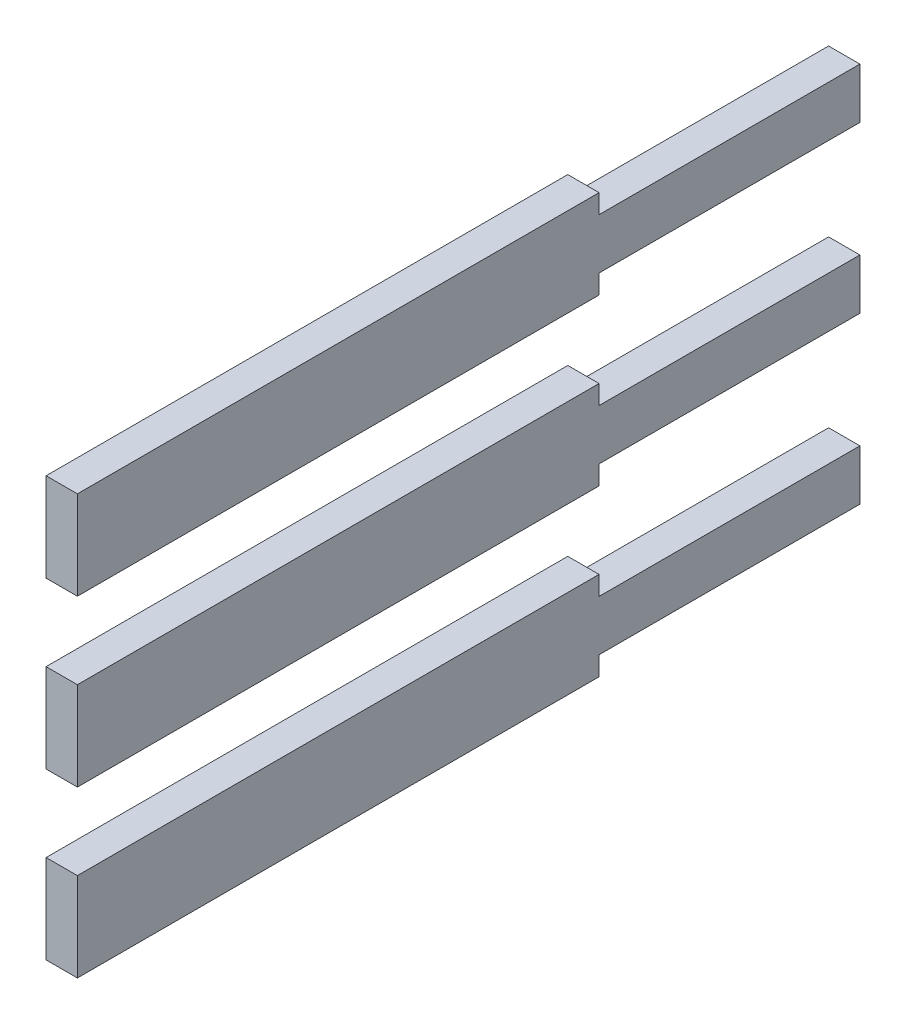
ISO-10303-21;
HEADER;
FILE_DESCRIPTION(('STEP AP214'),'2;1');
FILE_NAME('part.step','',(''),(''),'','','');
FILE_SCHEMA(('AUTOMOTIVE_DESIGN { 1 0 10303 214 1 1 1 1 }'));
ENDSEC;
DATA;
#1=APPLICATION_CONTEXT('core data for automotive mechanical design processes');
#2=APPLICATION_PROTOCOL_DEFINITION('international standard','automotive_design',2000,#1);
#3=PRODUCT_CONTEXT('',#1,'mechanical');
#4=PRODUCT('Part','Part','',(#3));
#5=PRODUCT_RELATED_PRODUCT_CATEGORY('part','',(#4));
#6=PRODUCT_DEFINITION_FORMATION('','',#4);
#7=PRODUCT_DEFINITION_CONTEXT('part definition',#1,'design');
#8=PRODUCT_DEFINITION('design','',#6,#7);
#9=PRODUCT_DEFINITION_SHAPE('','',#8);
#10=(LENGTH_UNIT() NAMED_UNIT(*) SI_UNIT(.MILLI.,.METRE.));
#11=(NAMED_UNIT(*) PLANE_ANGLE_UNIT() SI_UNIT($,.RADIAN.));
#12=(NAMED_UNIT(*) SI_UNIT($,.STERADIAN.) SOLID_ANGLE_UNIT());
#13=UNCERTAINTY_MEASURE_WITH_UNIT(LENGTH_MEASURE(1.E-05),#10,'distance_accuracy_value','');
#14=(GEOMETRIC_REPRESENTATION_CONTEXT(3) GLOBAL_UNCERTAINTY_ASSIGNED_CONTEXT((#13)) GLOBAL_UNIT_ASSIGNED_CONTEXT((#10,
#11,#12)) REPRESENTATION_CONTEXT('',''));
#15=CARTESIAN_POINT('',(0.,0.,0.));
#16=DIRECTION('',(0.,0.,1.));
#17=DIRECTION('',(1.,0.,0.));
#18=AXIS2_PLACEMENT_3D('',#15,#16,#17);
#19=CARTESIAN_POINT('',(-0.3,0.,0.));
#20=DIRECTION('',(1.,0.,0.));
#21=DIRECTION('',(0.,1.,0.));
#22=AXIS2_PLACEMENT_3D('',#19,#20,#21);
#23=PLANE('',#22);
#24=DIRECTION('',(0.,1.,0.));
#25=VECTOR('',#24,1.);
#26=CARTESIAN_POINT('',(-0.3,-0.68,0.));
#27=LINE('',#26,#25);
#28=CARTESIAN_POINT('',(-0.3,0.3875,0.));
#29=VERTEX_POINT('',#28);
#30=CARTESIAN_POINT('',(-0.3,0.68,0.));
#31=VERTEX_POINT('',#30);
#32=EDGE_CURVE('P0_E20',#29,#31,#27,.T.);
#33=ORIENTED_EDGE('',*,*,#32,.T.);
#34=DIRECTION('',(0.,0.,1.));
#35=VECTOR('',#34,1.);
#36=CARTESIAN_POINT('',(-0.3,0.68,0.));
#37=LINE('',#36,#35);
#38=CARTESIAN_POINT('',(-0.3,0.68,8.));
#39=VERTEX_POINT('',#38);
#40=EDGE_CURVE('P0_E105',#31,#39,#37,.T.);
#41=ORIENTED_EDGE('',*,*,#40,.T.);
#42=DIRECTION('',(0.,-1.,0.));
#43=VECTOR('',#42,1.);
#44=CARTESIAN_POINT('',(-0.3,0.68,8.));
#45=LINE('',#44,#43);
#46=CARTESIAN_POINT('',(-0.3,-0.68,8.));
#47=VERTEX_POINT('',#46);
#48=EDGE_CURVE('P0_E178',#39,#47,#45,.T.);
#49=ORIENTED_EDGE('',*,*,#48,.T.);
#50=DIRECTION('',(0.,0.,-1.));
#51=VECTOR('',#50,1.);
#52=CARTESIAN_POINT('',(-0.3,-0.68,8.));
#53=LINE('',#52,#51);
#54=CARTESIAN_POINT('',(-0.3,-0.68,0.));
#55=VERTEX_POINT('',#54);
#56=EDGE_CURVE('P0_E159',#47,#55,#53,.T.);
#57=ORIENTED_EDGE('',*,*,#56,.T.);
#58=DIRECTION('',(0.,1.,0.));
#59=VECTOR('',#58,1.);
#60=CARTESIAN_POINT('',(-0.3,-0.68,0.));
#61=LINE('',#60,#59);
#62=CARTESIAN_POINT('',(-0.3,-0.3875,0.));
#63=VERTEX_POINT('',#62);
#64=EDGE_CURVE('P0_E165',#55,#63,#61,.T.);
#65=ORIENTED_EDGE('',*,*,#64,.T.);
#66=DIRECTION('',(0.,0.,1.));
#67=VECTOR('',#66,1.);
#68=CARTESIAN_POINT('',(-0.3,-0.3875,-4.));
#69=LINE('',#68,#67);
#70=CARTESIAN_POINT('',(-0.3,-0.3875,-4.));
#71=VERTEX_POINT('',#70);
#72=EDGE_CURVE('P0_E27',#71,#63,#69,.T.);
#73=ORIENTED_EDGE('',*,*,#72,.F.);
#74=DIRECTION('',(0.,-1.,0.));
#75=VECTOR('',#74,1.);
#76=CARTESIAN_POINT('',(-0.3,0.3875,-4.));
#77=LINE('',#76,#75);
#78=CARTESIAN_POINT('',(-0.3,0.3875,-4.));
#79=VERTEX_POINT('',#78);
#80=EDGE_CURVE('P0_E11',#79,#71,#77,.T.);
#81=ORIENTED_EDGE('',*,*,#80,.F.);
#82=DIRECTION('',(0.,0.,-1.));
#83=VECTOR('',#82,1.);
#84=CARTESIAN_POINT('',(-0.3,0.3875,4.));
#85=LINE('',#84,#83);
#86=EDGE_CURVE('P0_E173',#29,#79,#85,.T.);
#87=ORIENTED_EDGE('',*,*,#86,.F.);
#88=EDGE_LOOP('',(#33,#41,#49,#57,#65,#73,#81,#87));
#89=FACE_BOUND('',#88,.T.);
#90=ADVANCED_FACE('P0_F16',(#89),#23,.T.);
#91=CARTESIAN_POINT('',(-0.3,0.3875,-4.));
#92=DIRECTION('',(0.,0.,-1.));
#93=DIRECTION('',(0.,-1.,0.));
#94=AXIS2_PLACEMENT_3D('',#91,#92,#93);
#95=PLANE('',#94);
#96=ORIENTED_EDGE('',*,*,#80,.T.);
#97=DIRECTION('',(-1.,0.,0.));
#98=VECTOR('',#97,1.);
#99=CARTESIAN_POINT('',(-0.3,-0.3875,-4.));
#100=LINE('',#99,#98);
#101=CARTESIAN_POINT('',(-0.78,-0.3875,-4.));
#102=VERTEX_POINT('',#101);
#103=EDGE_CURVE('P0_E184',#71,#102,#100,.T.);
#104=ORIENTED_EDGE('',*,*,#103,.T.);
#105=DIRECTION('',(0.,-1.,0.));
#106=VECTOR('',#105,1.);
#107=CARTESIAN_POINT('',(-0.78,0.3875,-4.));
#108=LINE('',#107,#106);
#109=CARTESIAN_POINT('',(-0.78,0.3875,-4.));
#110=VERTEX_POINT('',#109);
#111=EDGE_CURVE('P0_E138',#110,#102,#108,.T.);
#112=ORIENTED_EDGE('',*,*,#111,.F.);
#113=DIRECTION('',(-1.,0.,0.));
#114=VECTOR('',#113,1.);
#115=CARTESIAN_POINT('',(-0.3,0.3875,-4.));
#116=LINE('',#115,#114);
#117=EDGE_CURVE('P0_E177',#79,#110,#116,.T.);
#118=ORIENTED_EDGE('',*,*,#117,.F.);
#119=EDGE_LOOP('',(#96,#104,#112,#118));
#120=FACE_BOUND('',#119,.T.);
#121=ADVANCED_FACE('P0_F282',(#120),#95,.T.);
#122=CARTESIAN_POINT('',(-0.3,-0.3875,-4.));
#123=DIRECTION('',(0.,-1.,0.));
#124=DIRECTION('',(0.,0.,-1.));
#125=AXIS2_PLACEMENT_3D('',#122,#123,#124);
#126=PLANE('',#125);
#127=DIRECTION('',(-1.,0.,0.));
#128=VECTOR('',#127,1.);
#129=CARTESIAN_POINT('',(-0.3,-0.3875,0.));
#130=LINE('',#129,#128);
#131=CARTESIAN_POINT('',(-0.78,-0.3875,0.));
#132=VERTEX_POINT('',#131);
#133=EDGE_CURVE('P0_E136',#63,#132,#130,.T.);
#134=ORIENTED_EDGE('',*,*,#133,.T.);
#135=DIRECTION('',(0.,0.,1.));
#136=VECTOR('',#135,1.);
#137=CARTESIAN_POINT('',(-0.78,-0.3875,-4.));
#138=LINE('',#137,#136);
#139=EDGE_CURVE('P0_E141',#102,#132,#138,.T.);
#140=ORIENTED_EDGE('',*,*,#139,.F.);
#141=ORIENTED_EDGE('',*,*,#103,.F.);
#142=ORIENTED_EDGE('',*,*,#72,.T.);
#143=EDGE_LOOP('',(#134,#140,#141,#142));
#144=FACE_BOUND('',#143,.T.);
#145=ADVANCED_FACE('P0_F194',(#144),#126,.T.);
#146=CARTESIAN_POINT('',(-0.3,0.3875,4.));
#147=DIRECTION('',(0.,1.,0.));
#148=DIRECTION('',(1.,0.,0.));
#149=AXIS2_PLACEMENT_3D('',#146,#147,#148);
#150=PLANE('',#149);
#151=DIRECTION('',(1.,0.,0.));
#152=VECTOR('',#151,1.);
#153=CARTESIAN_POINT('',(-0.3,0.3875,0.));
#154=LINE('',#153,#152);
#155=CARTESIAN_POINT('',(-0.78,0.3875,0.));
#156=VERTEX_POINT('',#155);
#157=EDGE_CURVE('P0_E110',#156,#29,#154,.T.);
#158=ORIENTED_EDGE('',*,*,#157,.T.);
#159=ORIENTED_EDGE('',*,*,#86,.T.);
#160=ORIENTED_EDGE('',*,*,#117,.T.);
#161=DIRECTION('',(0.,0.,-1.));
#162=VECTOR('',#161,1.);
#163=CARTESIAN_POINT('',(-0.78,0.3875,4.));
#164=LINE('',#163,#162);
#165=EDGE_CURVE('P0_E120',#156,#110,#164,.T.);
#166=ORIENTED_EDGE('',*,*,#165,.F.);
#167=EDGE_LOOP('',(#158,#159,#160,#166));
#168=FACE_BOUND('',#167,.T.);
#169=ADVANCED_FACE('P0_F18',(#168),#150,.T.);
#170=CARTESIAN_POINT('',(-0.3,-0.68,8.));
#171=DIRECTION('',(0.,0.,1.));
#172=DIRECTION('',(1.,0.,0.));
#173=AXIS2_PLACEMENT_3D('',#170,#171,#172);
#174=PLANE('',#173);
#175=ORIENTED_EDGE('',*,*,#48,.F.);
#176=DIRECTION('',(-1.,0.,0.));
#177=VECTOR('',#176,1.);
#178=CARTESIAN_POINT('',(-0.3,0.68,8.));
#179=LINE('',#178,#177);
#180=CARTESIAN_POINT('',(-0.78,0.68,8.));
#181=VERTEX_POINT('',#180);
#182=EDGE_CURVE('P0_E162',#39,#181,#179,.T.);
#183=ORIENTED_EDGE('',*,*,#182,.T.);
#184=DIRECTION('',(0.,1.,0.));
#185=VECTOR('',#184,1.);
#186=CARTESIAN_POINT('',(-0.78,0.68,8.));
#187=LINE('',#186,#185);
#188=CARTESIAN_POINT('',(-0.78,-0.68,8.));
#189=VERTEX_POINT('',#188);
#190=EDGE_CURVE('P0_E126',#189,#181,#187,.T.);
#191=ORIENTED_EDGE('',*,*,#190,.F.);
#192=DIRECTION('',(-1.,0.,0.));
#193=VECTOR('',#192,1.);
#194=CARTESIAN_POINT('',(-0.3,-0.68,8.));
#195=LINE('',#194,#193);
#196=EDGE_CURVE('P0_E155',#47,#189,#195,.T.);
#197=ORIENTED_EDGE('',*,*,#196,.F.);
#198=EDGE_LOOP('',(#175,#183,#191,#197));
#199=FACE_BOUND('',#198,.T.);
#200=ADVANCED_FACE('P0_F280',(#199),#174,.T.);
#201=CARTESIAN_POINT('',(-0.3,0.68,8.));
#202=DIRECTION('',(0.,1.,0.));
#203=DIRECTION('',(1.,0.,0.));
#204=AXIS2_PLACEMENT_3D('',#201,#202,#203);
#205=PLANE('',#204);
#206=ORIENTED_EDGE('',*,*,#40,.F.);
#207=DIRECTION('',(-1.,0.,0.));
#208=VECTOR('',#207,1.);
#209=CARTESIAN_POINT('',(-0.3,0.68,0.));
#210=LINE('',#209,#208);
#211=CARTESIAN_POINT('',(-0.78,0.68,0.));
#212=VERTEX_POINT('',#211);
#213=EDGE_CURVE('P0_E97',#31,#212,#210,.T.);
#214=ORIENTED_EDGE('',*,*,#213,.T.);
#215=DIRECTION('',(0.,0.,-1.));
#216=VECTOR('',#215,1.);
#217=CARTESIAN_POINT('',(-0.78,0.68,0.));
#218=LINE('',#217,#216);
#219=EDGE_CURVE('P0_E102',#181,#212,#218,.T.);
#220=ORIENTED_EDGE('',*,*,#219,.F.);
#221=ORIENTED_EDGE('',*,*,#182,.F.);
#222=EDGE_LOOP('',(#206,#214,#220,#221));
#223=FACE_BOUND('',#222,.T.);
#224=ADVANCED_FACE('P0_F99',(#223),#205,.T.);
#225=CARTESIAN_POINT('',(-0.3,0.68,0.));
#226=DIRECTION('',(0.,0.,-1.));
#227=DIRECTION('',(0.,-1.,0.));
#228=AXIS2_PLACEMENT_3D('',#225,#226,#227);
#229=PLANE('',#228);
#230=ORIENTED_EDGE('',*,*,#157,.F.);
#231=DIRECTION('',(0.,-1.,0.));
#232=VECTOR('',#231,1.);
#233=CARTESIAN_POINT('',(-0.78,-0.68,0.));
#234=LINE('',#233,#232);
#235=EDGE_CURVE('P0_E113',#212,#156,#234,.T.);
#236=ORIENTED_EDGE('',*,*,#235,.F.);
#237=ORIENTED_EDGE('',*,*,#213,.F.);
#238=ORIENTED_EDGE('',*,*,#32,.F.);
#239=EDGE_LOOP('',(#230,#236,#237,#238));
#240=FACE_BOUND('',#239,.T.);
#241=ADVANCED_FACE('P0_F114',(#240),#229,.T.);
#242=CARTESIAN_POINT('',(-0.3,-0.68,0.));
#243=DIRECTION('',(0.,-1.,0.));
#244=DIRECTION('',(0.,0.,-1.));
#245=AXIS2_PLACEMENT_3D('',#242,#243,#244);
#246=PLANE('',#245);
#247=ORIENTED_EDGE('',*,*,#56,.F.);
#248=ORIENTED_EDGE('',*,*,#196,.T.);
#249=DIRECTION('',(0.,0.,1.));
#250=VECTOR('',#249,1.);
#251=CARTESIAN_POINT('',(-0.78,-0.68,8.));
#252=LINE('',#251,#250);
#253=CARTESIAN_POINT('',(-0.78,-0.68,0.));
#254=VERTEX_POINT('',#253);
#255=EDGE_CURVE('P0_E133',#254,#189,#252,.T.);
#256=ORIENTED_EDGE('',*,*,#255,.F.);
#257=DIRECTION('',(-1.,0.,0.));
#258=VECTOR('',#257,1.);
#259=CARTESIAN_POINT('',(-0.3,-0.68,0.));
#260=LINE('',#259,#258);
#261=EDGE_CURVE('P0_E169',#55,#254,#260,.T.);
#262=ORIENTED_EDGE('',*,*,#261,.F.);
#263=EDGE_LOOP('',(#247,#248,#256,#262));
#264=FACE_BOUND('',#263,.T.);
#265=ADVANCED_FACE('P0_F277',(#264),#246,.T.);
#266=CARTESIAN_POINT('',(-0.3,0.68,0.));
#267=DIRECTION('',(0.,0.,-1.));
#268=DIRECTION('',(0.,-1.,0.));
#269=AXIS2_PLACEMENT_3D('',#266,#267,#268);
#270=PLANE('',#269);
#271=ORIENTED_EDGE('',*,*,#133,.F.);
#272=ORIENTED_EDGE('',*,*,#64,.F.);
#273=ORIENTED_EDGE('',*,*,#261,.T.);
#274=DIRECTION('',(0.,-1.,0.));
#275=VECTOR('',#274,1.);
#276=CARTESIAN_POINT('',(-0.78,-0.68,0.));
#277=LINE('',#276,#275);
#278=EDGE_CURVE('P0_E170',#132,#254,#277,.T.);
#279=ORIENTED_EDGE('',*,*,#278,.F.);
#280=EDGE_LOOP('',(#271,#272,#273,#279));
#281=FACE_BOUND('',#280,.T.);
#282=ADVANCED_FACE('P0_F202',(#281),#270,.T.);
#283=CARTESIAN_POINT('',(-0.78,0.,4.));
#284=DIRECTION('',(-1.,0.,0.));
#285=DIRECTION('',(0.,0.,1.));
#286=AXIS2_PLACEMENT_3D('',#283,#284,#285);
#287=PLANE('',#286);
#288=ORIENTED_EDGE('',*,*,#278,.T.);
#289=ORIENTED_EDGE('',*,*,#255,.T.);
#290=ORIENTED_EDGE('',*,*,#190,.T.);
#291=ORIENTED_EDGE('',*,*,#219,.T.);
#292=ORIENTED_EDGE('',*,*,#235,.T.);
#293=ORIENTED_EDGE('',*,*,#165,.T.);
#294=ORIENTED_EDGE('',*,*,#111,.T.);
#295=ORIENTED_EDGE('',*,*,#139,.T.);
#296=EDGE_LOOP('',(#288,#289,#290,#291,#292,#293,#294,#295));
#297=FACE_BOUND('',#296,.T.);
#298=ADVANCED_FACE('P0_F123',(#297),#287,.T.);
#299=CLOSED_SHELL('',(#90,#121,#145,#169,#200,#224,#241,#265,#282,#298));
#300=MANIFOLD_SOLID_BREP('P0_B1',#299);
#301=CARTESIAN_POINT('',(-0.3,2.535,0.));
#302=DIRECTION('',(1.,0.,0.));
#303=DIRECTION('',(0.,1.,0.));
#304=AXIS2_PLACEMENT_3D('',#301,#302,#303);
#305=PLANE('',#304);
#306=DIRECTION('',(0.,1.,0.));
#307=VECTOR('',#306,1.);
#308=CARTESIAN_POINT('',(-0.3,1.855,0.));
#309=LINE('',#308,#307);
#310=CARTESIAN_POINT('',(-0.3,2.9225,0.));
#311=VERTEX_POINT('',#310);
#312=CARTESIAN_POINT('',(-0.3,3.215,0.));
#313=VERTEX_POINT('',#312);
#314=EDGE_CURVE('P1_E156',#311,#313,#309,.T.);
#315=ORIENTED_EDGE('',*,*,#314,.T.);
#316=DIRECTION('',(0.,0.,1.));
#317=VECTOR('',#316,1.);
#318=CARTESIAN_POINT('',(-0.3,3.215,0.));
#319=LINE('',#318,#317);
#320=CARTESIAN_POINT('',(-0.3,3.215,8.));
#321=VERTEX_POINT('',#320);
#322=EDGE_CURVE('P1_E152',#313,#321,#319,.T.);
#323=ORIENTED_EDGE('',*,*,#322,.T.);
#324=DIRECTION('',(0.,-1.,0.));
#325=VECTOR('',#324,1.);
#326=CARTESIAN_POINT('',(-0.3,3.215,8.));
#327=LINE('',#326,#325);
#328=CARTESIAN_POINT('',(-0.3,1.855,8.));
#329=VERTEX_POINT('',#328);
#330=EDGE_CURVE('P1_E160',#321,#329,#327,.T.);
#331=ORIENTED_EDGE('',*,*,#330,.T.);
#332=DIRECTION('',(0.,0.,-1.));
#333=VECTOR('',#332,1.);
#334=CARTESIAN_POINT('',(-0.3,1.855,8.));
#335=LINE('',#334,#333);
#336=CARTESIAN_POINT('',(-0.3,1.855,0.));
#337=VERTEX_POINT('',#336);
#338=EDGE_CURVE('P1_E168',#329,#337,#335,.T.);
#339=ORIENTED_EDGE('',*,*,#338,.T.);
#340=DIRECTION('',(0.,1.,0.));
#341=VECTOR('',#340,1.);
#342=CARTESIAN_POINT('',(-0.3,1.855,0.));
#343=LINE('',#342,#341);
#344=CARTESIAN_POINT('',(-0.3,2.1475,0.));
#345=VERTEX_POINT('',#344);
#346=EDGE_CURVE('P1_E121',#337,#345,#343,.T.);
#347=ORIENTED_EDGE('',*,*,#346,.T.);
#348=DIRECTION('',(0.,0.,1.));
#349=VECTOR('',#348,1.);
#350=CARTESIAN_POINT('',(-0.3,2.1475,-4.));
#351=LINE('',#350,#349);
#352=CARTESIAN_POINT('',(-0.3,2.1475,-4.));
#353=VERTEX_POINT('',#352);
#354=EDGE_CURVE('P1_E27',#353,#345,#351,.T.);
#355=ORIENTED_EDGE('',*,*,#354,.F.);
#356=DIRECTION('',(0.,-1.,0.));
#357=VECTOR('',#356,1.);
#358=CARTESIAN_POINT('',(-0.3,2.9225,-4.));
#359=LINE('',#358,#357);
#360=CARTESIAN_POINT('',(-0.3,2.9225,-4.));
#361=VERTEX_POINT('',#360);
#362=EDGE_CURVE('P1_E11',#361,#353,#359,.T.);
#363=ORIENTED_EDGE('',*,*,#362,.F.);
#364=DIRECTION('',(0.,0.,-1.));
#365=VECTOR('',#364,1.);
#366=CARTESIAN_POINT('',(-0.3,2.9225,4.));
#367=LINE('',#366,#365);
#368=EDGE_CURVE('P1_E162',#311,#361,#367,.T.);
#369=ORIENTED_EDGE('',*,*,#368,.F.);
#370=EDGE_LOOP('',(#315,#323,#331,#339,#347,#355,#363,#369));
#371=FACE_BOUND('',#370,.T.);
#372=ADVANCED_FACE('P1_F16',(#371),#305,.T.);
#373=CARTESIAN_POINT('',(-0.3,2.9225,-4.));
#374=DIRECTION('',(0.,0.,-1.));
#375=DIRECTION('',(0.,-1.,0.));
#376=AXIS2_PLACEMENT_3D('',#373,#374,#375);
#377=PLANE('',#376);
#378=ORIENTED_EDGE('',*,*,#362,.T.);
#379=DIRECTION('',(-1.,0.,0.));
#380=VECTOR('',#379,1.);
#381=CARTESIAN_POINT('',(-0.3,2.1475,-4.));
#382=LINE('',#381,#380);
#383=CARTESIAN_POINT('',(-0.78,2.1475,-4.));
#384=VERTEX_POINT('',#383);
#385=EDGE_CURVE('P1_E194',#353,#384,#382,.T.);
#386=ORIENTED_EDGE('',*,*,#385,.T.);
#387=DIRECTION('',(0.,-1.,0.));
#388=VECTOR('',#387,1.);
#389=CARTESIAN_POINT('',(-0.78,2.9225,-4.));
#390=LINE('',#389,#388);
#391=CARTESIAN_POINT('',(-0.78,2.9225,-4.));
#392=VERTEX_POINT('',#391);
#393=EDGE_CURVE('P1_E130',#392,#384,#390,.T.);
#394=ORIENTED_EDGE('',*,*,#393,.F.);
#395=DIRECTION('',(-1.,0.,0.));
#396=VECTOR('',#395,1.);
#397=CARTESIAN_POINT('',(-0.3,2.9225,-4.));
#398=LINE('',#397,#396);
#399=EDGE_CURVE('P1_E148',#361,#392,#398,.T.);
#400=ORIENTED_EDGE('',*,*,#399,.F.);
#401=EDGE_LOOP('',(#378,#386,#394,#400));
#402=FACE_BOUND('',#401,.T.);
#403=ADVANCED_FACE('P1_F274',(#402),#377,.T.);
#404=CARTESIAN_POINT('',(-0.3,2.1475,-4.));
#405=DIRECTION('',(0.,-1.,0.));
#406=DIRECTION('',(0.,0.,-1.));
#407=AXIS2_PLACEMENT_3D('',#404,#405,#406);
#408=PLANE('',#407);
#409=DIRECTION('',(-1.,0.,0.));
#410=VECTOR('',#409,1.);
#411=CARTESIAN_POINT('',(-0.3,2.1475,0.));
#412=LINE('',#411,#410);
#413=CARTESIAN_POINT('',(-0.78,2.1475,0.));
#414=VERTEX_POINT('',#413);
#415=EDGE_CURVE('P1_E110',#345,#414,#412,.T.);
#416=ORIENTED_EDGE('',*,*,#415,.T.);
#417=DIRECTION('',(0.,0.,1.));
#418=VECTOR('',#417,1.);
#419=CARTESIAN_POINT('',(-0.78,2.1475,-4.));
#420=LINE('',#419,#418);
#421=EDGE_CURVE('P1_E114',#384,#414,#420,.T.);
#422=ORIENTED_EDGE('',*,*,#421,.F.);
#423=ORIENTED_EDGE('',*,*,#385,.F.);
#424=ORIENTED_EDGE('',*,*,#354,.T.);
#425=EDGE_LOOP('',(#416,#422,#423,#424));
#426=FACE_BOUND('',#425,.T.);
#427=ADVANCED_FACE('P1_F112',(#426),#408,.T.);
#428=CARTESIAN_POINT('',(-0.3,2.9225,4.));
#429=DIRECTION('',(0.,1.,0.));
#430=DIRECTION('',(1.,0.,0.));
#431=AXIS2_PLACEMENT_3D('',#428,#429,#430);
#432=PLANE('',#431);
#433=DIRECTION('',(1.,0.,0.));
#434=VECTOR('',#433,1.);
#435=CARTESIAN_POINT('',(-0.3,2.9225,0.));
#436=LINE('',#435,#434);
#437=CARTESIAN_POINT('',(-0.78,2.9225,0.));
#438=VERTEX_POINT('',#437);
#439=EDGE_CURVE('P1_E83',#438,#311,#436,.T.);
#440=ORIENTED_EDGE('',*,*,#439,.T.);
#441=ORIENTED_EDGE('',*,*,#368,.T.);
#442=ORIENTED_EDGE('',*,*,#399,.T.);
#443=DIRECTION('',(0.,0.,-1.));
#444=VECTOR('',#443,1.);
#445=CARTESIAN_POINT('',(-0.78,2.9225,4.));
#446=LINE('',#445,#444);
#447=EDGE_CURVE('P1_E159',#438,#392,#446,.T.);
#448=ORIENTED_EDGE('',*,*,#447,.F.);
#449=EDGE_LOOP('',(#440,#441,#442,#448));
#450=FACE_BOUND('',#449,.T.);
#451=ADVANCED_FACE('P1_F273',(#450),#432,.T.);
#452=CARTESIAN_POINT('',(-0.3,1.855,8.));
#453=DIRECTION('',(0.,0.,1.));
#454=DIRECTION('',(1.,0.,0.));
#455=AXIS2_PLACEMENT_3D('',#452,#453,#454);
#456=PLANE('',#455);
#457=ORIENTED_EDGE('',*,*,#330,.F.);
#458=DIRECTION('',(-1.,0.,0.));
#459=VECTOR('',#458,1.);
#460=CARTESIAN_POINT('',(-0.3,3.215,8.));
#461=LINE('',#460,#459);
#462=CARTESIAN_POINT('',(-0.78,3.215,8.));
#463=VERTEX_POINT('',#462);
#464=EDGE_CURVE('P1_E20',#321,#463,#461,.T.);
#465=ORIENTED_EDGE('',*,*,#464,.T.);
#466=DIRECTION('',(0.,1.,0.));
#467=VECTOR('',#466,1.);
#468=CARTESIAN_POINT('',(-0.78,3.215,8.));
#469=LINE('',#468,#467);
#470=CARTESIAN_POINT('',(-0.78,1.855,8.));
#471=VERTEX_POINT('',#470);
#472=EDGE_CURVE('P1_E144',#471,#463,#469,.T.);
#473=ORIENTED_EDGE('',*,*,#472,.F.);
#474=DIRECTION('',(-1.,0.,0.));
#475=VECTOR('',#474,1.);
#476=CARTESIAN_POINT('',(-0.3,1.855,8.));
#477=LINE('',#476,#475);
#478=EDGE_CURVE('P1_E166',#329,#471,#477,.T.);
#479=ORIENTED_EDGE('',*,*,#478,.F.);
#480=EDGE_LOOP('',(#457,#465,#473,#479));
#481=FACE_BOUND('',#480,.T.);
#482=ADVANCED_FACE('P1_F18',(#481),#456,.T.);
#483=CARTESIAN_POINT('',(-0.3,3.215,8.));
#484=DIRECTION('',(0.,1.,0.));
#485=DIRECTION('',(1.,0.,0.));
#486=AXIS2_PLACEMENT_3D('',#483,#484,#485);
#487=PLANE('',#486);
#488=ORIENTED_EDGE('',*,*,#322,.F.);
#489=DIRECTION('',(-1.,0.,0.));
#490=VECTOR('',#489,1.);
#491=CARTESIAN_POINT('',(-0.3,3.215,0.));
#492=LINE('',#491,#490);
#493=CARTESIAN_POINT('',(-0.78,3.215,0.));
#494=VERTEX_POINT('',#493);
#495=EDGE_CURVE('P1_E96',#313,#494,#492,.T.);
#496=ORIENTED_EDGE('',*,*,#495,.T.);
#497=DIRECTION('',(0.,0.,-1.));
#498=VECTOR('',#497,1.);
#499=CARTESIAN_POINT('',(-0.78,3.215,0.));
#500=LINE('',#499,#498);
#501=EDGE_CURVE('P1_E185',#463,#494,#500,.T.);
#502=ORIENTED_EDGE('',*,*,#501,.F.);
#503=ORIENTED_EDGE('',*,*,#464,.F.);
#504=EDGE_LOOP('',(#488,#496,#502,#503));
#505=FACE_BOUND('',#504,.T.);
#506=ADVANCED_FACE('P1_F293',(#505),#487,.T.);
#507=CARTESIAN_POINT('',(-0.3,3.215,0.));
#508=DIRECTION('',(0.,0.,-1.));
#509=DIRECTION('',(0.,-1.,0.));
#510=AXIS2_PLACEMENT_3D('',#507,#508,#509);
#511=PLANE('',#510);
#512=ORIENTED_EDGE('',*,*,#439,.F.);
#513=DIRECTION('',(0.,-1.,0.));
#514=VECTOR('',#513,1.);
#515=CARTESIAN_POINT('',(-0.78,1.855,0.));
#516=LINE('',#515,#514);
#517=EDGE_CURVE('P1_E165',#494,#438,#516,.T.);
#518=ORIENTED_EDGE('',*,*,#517,.F.);
#519=ORIENTED_EDGE('',*,*,#495,.F.);
#520=ORIENTED_EDGE('',*,*,#314,.F.);
#521=EDGE_LOOP('',(#512,#518,#519,#520));
#522=FACE_BOUND('',#521,.T.);
#523=ADVANCED_FACE('P1_F287',(#522),#511,.T.);
#524=CARTESIAN_POINT('',(-0.3,1.855,0.));
#525=DIRECTION('',(0.,-1.,0.));
#526=DIRECTION('',(0.,0.,-1.));
#527=AXIS2_PLACEMENT_3D('',#524,#525,#526);
#528=PLANE('',#527);
#529=ORIENTED_EDGE('',*,*,#338,.F.);
#530=ORIENTED_EDGE('',*,*,#478,.T.);
#531=DIRECTION('',(0.,0.,1.));
#532=VECTOR('',#531,1.);
#533=CARTESIAN_POINT('',(-0.78,1.855,8.));
#534=LINE('',#533,#532);
#535=CARTESIAN_POINT('',(-0.78,1.855,0.));
#536=VERTEX_POINT('',#535);
#537=EDGE_CURVE('P1_E138',#536,#471,#534,.T.);
#538=ORIENTED_EDGE('',*,*,#537,.F.);
#539=DIRECTION('',(-1.,0.,0.));
#540=VECTOR('',#539,1.);
#541=CARTESIAN_POINT('',(-0.3,1.855,0.));
#542=LINE('',#541,#540);
#543=EDGE_CURVE('P1_E135',#337,#536,#542,.T.);
#544=ORIENTED_EDGE('',*,*,#543,.F.);
#545=EDGE_LOOP('',(#529,#530,#538,#544));
#546=FACE_BOUND('',#545,.T.);
#547=ADVANCED_FACE('P1_F292',(#546),#528,.T.);
#548=CARTESIAN_POINT('',(-0.3,3.215,0.));
#549=DIRECTION('',(0.,0.,-1.));
#550=DIRECTION('',(0.,-1.,0.));
#551=AXIS2_PLACEMENT_3D('',#548,#549,#550);
#552=PLANE('',#551);
#553=ORIENTED_EDGE('',*,*,#415,.F.);
#554=ORIENTED_EDGE('',*,*,#346,.F.);
#555=ORIENTED_EDGE('',*,*,#543,.T.);
#556=DIRECTION('',(0.,-1.,0.));
#557=VECTOR('',#556,1.);
#558=CARTESIAN_POINT('',(-0.78,1.855,0.));
#559=LINE('',#558,#557);
#560=EDGE_CURVE('P1_E127',#414,#536,#559,.T.);
#561=ORIENTED_EDGE('',*,*,#560,.F.);
#562=EDGE_LOOP('',(#553,#554,#555,#561));
#563=FACE_BOUND('',#562,.T.);
#564=ADVANCED_FACE('P1_F133',(#563),#552,.T.);
#565=CARTESIAN_POINT('',(-0.78,2.535,4.));
#566=DIRECTION('',(-1.,0.,0.));
#567=DIRECTION('',(0.,0.,1.));
#568=AXIS2_PLACEMENT_3D('',#565,#566,#567);
#569=PLANE('',#568);
#570=ORIENTED_EDGE('',*,*,#560,.T.);
#571=ORIENTED_EDGE('',*,*,#537,.T.);
#572=ORIENTED_EDGE('',*,*,#472,.T.);
#573=ORIENTED_EDGE('',*,*,#501,.T.);
#574=ORIENTED_EDGE('',*,*,#517,.T.);
#575=ORIENTED_EDGE('',*,*,#447,.T.);
#576=ORIENTED_EDGE('',*,*,#393,.T.);
#577=ORIENTED_EDGE('',*,*,#421,.T.);
#578=EDGE_LOOP('',(#570,#571,#572,#573,#574,#575,#576,#577));
#579=FACE_BOUND('',#578,.T.);
#580=ADVANCED_FACE('P1_F125',(#579),#569,.T.);
#581=CLOSED_SHELL('',(#372,#403,#427,#451,#482,#506,#523,#547,#564,#580));
#582=MANIFOLD_SOLID_BREP('P1_B1',#581);
#583=CARTESIAN_POINT('',(-0.3,-2.535,0.));
#584=DIRECTION('',(1.,0.,0.));
#585=DIRECTION('',(0.,1.,0.));
#586=AXIS2_PLACEMENT_3D('',#583,#584,#585);
#587=PLANE('',#586);
#588=DIRECTION('',(0.,1.,0.));
#589=VECTOR('',#588,1.);
#590=CARTESIAN_POINT('',(-0.3,-3.215,0.));
#591=LINE('',#590,#589);
#592=CARTESIAN_POINT('',(-0.3,-2.1475,0.));
#593=VERTEX_POINT('',#592);
#594=CARTESIAN_POINT('',(-0.3,-1.855,0.));
#595=VERTEX_POINT('',#594);
#596=EDGE_CURVE('P2_E94',#593,#595,#591,.T.);
#597=ORIENTED_EDGE('',*,*,#596,.T.);
#598=DIRECTION('',(0.,0.,1.));
#599=VECTOR('',#598,1.);
#600=CARTESIAN_POINT('',(-0.3,-1.855,0.));
#601=LINE('',#600,#599);
#602=CARTESIAN_POINT('',(-0.3,-1.855,8.));
#603=VERTEX_POINT('',#602);
#604=EDGE_CURVE('P2_E84',#595,#603,#601,.T.);
#605=ORIENTED_EDGE('',*,*,#604,.T.);
#606=DIRECTION('',(0.,-1.,0.));
#607=VECTOR('',#606,1.);
#608=CARTESIAN_POINT('',(-0.3,-1.855,8.));
#609=LINE('',#608,#607);
#610=CARTESIAN_POINT('',(-0.3,-3.215,8.));
#611=VERTEX_POINT('',#610);
#612=EDGE_CURVE('P2_E76',#603,#611,#609,.T.);
#613=ORIENTED_EDGE('',*,*,#612,.T.);
#614=DIRECTION('',(0.,0.,-1.));
#615=VECTOR('',#614,1.);
#616=CARTESIAN_POINT('',(-0.3,-3.215,8.));
#617=LINE('',#616,#615);
#618=CARTESIAN_POINT('',(-0.3,-3.215,0.));
#619=VERTEX_POINT('',#618);
#620=EDGE_CURVE('P2_E140',#611,#619,#617,.T.);
#621=ORIENTED_EDGE('',*,*,#620,.T.);
#622=DIRECTION('',(0.,1.,0.));
#623=VECTOR('',#622,1.);
#624=CARTESIAN_POINT('',(-0.3,-3.215,0.));
#625=LINE('',#624,#623);
#626=CARTESIAN_POINT('',(-0.3,-2.9225,0.));
#627=VERTEX_POINT('',#626);
#628=EDGE_CURVE('P2_E148',#619,#627,#625,.T.);
#629=ORIENTED_EDGE('',*,*,#628,.T.);
#630=DIRECTION('',(0.,0.,1.));
#631=VECTOR('',#630,1.);
#632=CARTESIAN_POINT('',(-0.3,-2.9225,-4.));
#633=LINE('',#632,#631);
#634=CARTESIAN_POINT('',(-0.3,-2.9225,-4.));
#635=VERTEX_POINT('',#634);
#636=EDGE_CURVE('P2_E20',#635,#627,#633,.T.);
#637=ORIENTED_EDGE('',*,*,#636,.F.);
#638=DIRECTION('',(0.,-1.,0.));
#639=VECTOR('',#638,1.);
#640=CARTESIAN_POINT('',(-0.3,-2.1475,-4.));
#641=LINE('',#640,#639);
#642=CARTESIAN_POINT('',(-0.3,-2.1475,-4.));
#643=VERTEX_POINT('',#642);
#644=EDGE_CURVE('P2_E11',#643,#635,#641,.T.);
#645=ORIENTED_EDGE('',*,*,#644,.F.);
#646=DIRECTION('',(0.,0.,-1.));
#647=VECTOR('',#646,1.);
#648=CARTESIAN_POINT('',(-0.3,-2.1475,4.));
#649=LINE('',#648,#647);
#650=EDGE_CURVE('P2_E98',#593,#643,#649,.T.);
#651=ORIENTED_EDGE('',*,*,#650,.F.);
#652=EDGE_LOOP('',(#597,#605,#613,#621,#629,#637,#645,#651));
#653=FACE_BOUND('',#652,.T.);
#654=ADVANCED_FACE('P2_F16',(#653),#587,.T.);
#655=CARTESIAN_POINT('',(-0.3,-2.1475,-4.));
#656=DIRECTION('',(0.,0.,-1.));
#657=DIRECTION('',(0.,-1.,0.));
#658=AXIS2_PLACEMENT_3D('',#655,#656,#657);
#659=PLANE('',#658);
#660=ORIENTED_EDGE('',*,*,#644,.T.);
#661=DIRECTION('',(-1.,0.,0.));
#662=VECTOR('',#661,1.);
#663=CARTESIAN_POINT('',(-0.3,-2.9225,-4.));
#664=LINE('',#663,#662);
#665=CARTESIAN_POINT('',(-0.78,-2.9225,-4.));
#666=VERTEX_POINT('',#665);
#667=EDGE_CURVE('P2_E160',#635,#666,#664,.T.);
#668=ORIENTED_EDGE('',*,*,#667,.T.);
#669=DIRECTION('',(0.,-1.,0.));
#670=VECTOR('',#669,1.);
#671=CARTESIAN_POINT('',(-0.78,-2.1475,-4.));
#672=LINE('',#671,#670);
#673=CARTESIAN_POINT('',(-0.78,-2.1475,-4.));
#674=VERTEX_POINT('',#673);
#675=EDGE_CURVE('P2_E119',#674,#666,#672,.T.);
#676=ORIENTED_EDGE('',*,*,#675,.F.);
#677=DIRECTION('',(-1.,0.,0.));
#678=VECTOR('',#677,1.);
#679=CARTESIAN_POINT('',(-0.3,-2.1475,-4.));
#680=LINE('',#679,#678);
#681=EDGE_CURVE('P2_E157',#643,#674,#680,.T.);
#682=ORIENTED_EDGE('',*,*,#681,.F.);
#683=EDGE_LOOP('',(#660,#668,#676,#682));
#684=FACE_BOUND('',#683,.T.);
#685=ADVANCED_FACE('P2_F220',(#684),#659,.T.);
#686=CARTESIAN_POINT('',(-0.3,-2.9225,-4.));
#687=DIRECTION('',(0.,-1.,0.));
#688=DIRECTION('',(0.,0.,-1.));
#689=AXIS2_PLACEMENT_3D('',#686,#687,#688);
#690=PLANE('',#689);
#691=DIRECTION('',(-1.,0.,0.));
#692=VECTOR('',#691,1.);
#693=CARTESIAN_POINT('',(-0.3,-2.9225,0.));
#694=LINE('',#693,#692);
#695=CARTESIAN_POINT('',(-0.78,-2.9225,0.));
#696=VERTEX_POINT('',#695);
#697=EDGE_CURVE('P2_E118',#627,#696,#694,.T.);
#698=ORIENTED_EDGE('',*,*,#697,.T.);
#699=DIRECTION('',(0.,0.,1.));
#700=VECTOR('',#699,1.);
#701=CARTESIAN_POINT('',(-0.78,-2.9225,-4.));
#702=LINE('',#701,#700);
#703=EDGE_CURVE('P2_E123',#666,#696,#702,.T.);
#704=ORIENTED_EDGE('',*,*,#703,.F.);
#705=ORIENTED_EDGE('',*,*,#667,.F.);
#706=ORIENTED_EDGE('',*,*,#636,.T.);
#707=EDGE_LOOP('',(#698,#704,#705,#706));
#708=FACE_BOUND('',#707,.T.);
#709=ADVANCED_FACE('P2_F203',(#708),#690,.T.);
#710=CARTESIAN_POINT('',(-0.3,-2.1475,4.));
#711=DIRECTION('',(0.,1.,0.));
#712=DIRECTION('',(1.,0.,0.));
#713=AXIS2_PLACEMENT_3D('',#710,#711,#712);
#714=PLANE('',#713);
#715=DIRECTION('',(1.,0.,0.));
#716=VECTOR('',#715,1.);
#717=CARTESIAN_POINT('',(-0.3,-2.1475,0.));
#718=LINE('',#717,#716);
#719=CARTESIAN_POINT('',(-0.78,-2.1475,0.));
#720=VERTEX_POINT('',#719);
#721=EDGE_CURVE('P2_E108',#720,#593,#718,.T.);
#722=ORIENTED_EDGE('',*,*,#721,.T.);
#723=ORIENTED_EDGE('',*,*,#650,.T.);
#724=ORIENTED_EDGE('',*,*,#681,.T.);
#725=DIRECTION('',(0.,0.,-1.));
#726=VECTOR('',#725,1.);
#727=CARTESIAN_POINT('',(-0.78,-2.1475,4.));
#728=LINE('',#727,#726);
#729=EDGE_CURVE('P2_E124',#720,#674,#728,.T.);
#730=ORIENTED_EDGE('',*,*,#729,.F.);
#731=EDGE_LOOP('',(#722,#723,#724,#730));
#732=FACE_BOUND('',#731,.T.);
#733=ADVANCED_FACE('P2_F228',(#732),#714,.T.);
#734=CARTESIAN_POINT('',(-0.3,-3.215,8.));
#735=DIRECTION('',(0.,0.,1.));
#736=DIRECTION('',(1.,0.,0.));
#737=AXIS2_PLACEMENT_3D('',#734,#735,#736);
#738=PLANE('',#737);
#739=ORIENTED_EDGE('',*,*,#612,.F.);
#740=DIRECTION('',(-1.,0.,0.));
#741=VECTOR('',#740,1.);
#742=CARTESIAN_POINT('',(-0.3,-1.855,8.));
#743=LINE('',#742,#741);
#744=CARTESIAN_POINT('',(-0.78,-1.855,8.));
#745=VERTEX_POINT('',#744);
#746=EDGE_CURVE('P2_E91',#603,#745,#743,.T.);
#747=ORIENTED_EDGE('',*,*,#746,.T.);
#748=DIRECTION('',(0.,1.,0.));
#749=VECTOR('',#748,1.);
#750=CARTESIAN_POINT('',(-0.78,-1.855,8.));
#751=LINE('',#750,#749);
#752=CARTESIAN_POINT('',(-0.78,-3.215,8.));
#753=VERTEX_POINT('',#752);
#754=EDGE_CURVE('P2_E136',#753,#745,#751,.T.);
#755=ORIENTED_EDGE('',*,*,#754,.F.);
#756=DIRECTION('',(-1.,0.,0.));
#757=VECTOR('',#756,1.);
#758=CARTESIAN_POINT('',(-0.3,-3.215,8.));
#759=LINE('',#758,#757);
#760=EDGE_CURVE('P2_E114',#611,#753,#759,.T.);
#761=ORIENTED_EDGE('',*,*,#760,.F.);
#762=EDGE_LOOP('',(#739,#747,#755,#761));
#763=FACE_BOUND('',#762,.T.);
#764=ADVANCED_FACE('P2_F231',(#763),#738,.T.);
#765=CARTESIAN_POINT('',(-0.3,-1.855,8.));
#766=DIRECTION('',(0.,1.,0.));
#767=DIRECTION('',(1.,0.,0.));
#768=AXIS2_PLACEMENT_3D('',#765,#766,#767);
#769=PLANE('',#768);
#770=ORIENTED_EDGE('',*,*,#604,.F.);
#771=DIRECTION('',(-1.,0.,0.));
#772=VECTOR('',#771,1.);
#773=CARTESIAN_POINT('',(-0.3,-1.855,0.));
#774=LINE('',#773,#772);
#775=CARTESIAN_POINT('',(-0.78,-1.855,0.));
#776=VERTEX_POINT('',#775);
#777=EDGE_CURVE('P2_E89',#595,#776,#774,.T.);
#778=ORIENTED_EDGE('',*,*,#777,.T.);
#779=DIRECTION('',(0.,0.,-1.));
#780=VECTOR('',#779,1.);
#781=CARTESIAN_POINT('',(-0.78,-1.855,0.));
#782=LINE('',#781,#780);
#783=EDGE_CURVE('P2_E133',#745,#776,#782,.T.);
#784=ORIENTED_EDGE('',*,*,#783,.F.);
#785=ORIENTED_EDGE('',*,*,#746,.F.);
#786=EDGE_LOOP('',(#770,#778,#784,#785));
#787=FACE_BOUND('',#786,.T.);
#788=ADVANCED_FACE('P2_F86',(#787),#769,.T.);
#789=CARTESIAN_POINT('',(-0.3,-1.855,0.));
#790=DIRECTION('',(0.,0.,-1.));
#791=DIRECTION('',(0.,-1.,0.));
#792=AXIS2_PLACEMENT_3D('',#789,#790,#791);
#793=PLANE('',#792);
#794=ORIENTED_EDGE('',*,*,#721,.F.);
#795=DIRECTION('',(0.,-1.,0.));
#796=VECTOR('',#795,1.);
#797=CARTESIAN_POINT('',(-0.78,-3.215,0.));
#798=LINE('',#797,#796);
#799=EDGE_CURVE('P2_E105',#776,#720,#798,.T.);
#800=ORIENTED_EDGE('',*,*,#799,.F.);
#801=ORIENTED_EDGE('',*,*,#777,.F.);
#802=ORIENTED_EDGE('',*,*,#596,.F.);
#803=EDGE_LOOP('',(#794,#800,#801,#802));
#804=FACE_BOUND('',#803,.T.);
#805=ADVANCED_FACE('P2_F18',(#804),#793,.T.);
#806=CARTESIAN_POINT('',(-0.3,-3.215,0.));
#807=DIRECTION('',(0.,-1.,0.));
#808=DIRECTION('',(0.,0.,-1.));
#809=AXIS2_PLACEMENT_3D('',#806,#807,#808);
#810=PLANE('',#809);
#811=ORIENTED_EDGE('',*,*,#620,.F.);
#812=ORIENTED_EDGE('',*,*,#760,.T.);
#813=DIRECTION('',(0.,0.,1.));
#814=VECTOR('',#813,1.);
#815=CARTESIAN_POINT('',(-0.78,-3.215,8.));
#816=LINE('',#815,#814);
#817=CARTESIAN_POINT('',(-0.78,-3.215,0.));
#818=VERTEX_POINT('',#817);
#819=EDGE_CURVE('P2_E129',#818,#753,#816,.T.);
#820=ORIENTED_EDGE('',*,*,#819,.F.);
#821=DIRECTION('',(-1.,0.,0.));
#822=VECTOR('',#821,1.);
#823=CARTESIAN_POINT('',(-0.3,-3.215,0.));
#824=LINE('',#823,#822);
#825=EDGE_CURVE('P2_E144',#619,#818,#824,.T.);
#826=ORIENTED_EDGE('',*,*,#825,.F.);
#827=EDGE_LOOP('',(#811,#812,#820,#826));
#828=FACE_BOUND('',#827,.T.);
#829=ADVANCED_FACE('P2_F209',(#828),#810,.T.);
#830=CARTESIAN_POINT('',(-0.3,-1.855,0.));
#831=DIRECTION('',(0.,0.,-1.));
#832=DIRECTION('',(0.,-1.,0.));
#833=AXIS2_PLACEMENT_3D('',#830,#831,#832);
#834=PLANE('',#833);
#835=ORIENTED_EDGE('',*,*,#697,.F.);
#836=ORIENTED_EDGE('',*,*,#628,.F.);
#837=ORIENTED_EDGE('',*,*,#825,.T.);
#838=DIRECTION('',(0.,-1.,0.));
#839=VECTOR('',#838,1.);
#840=CARTESIAN_POINT('',(-0.78,-3.215,0.));
#841=LINE('',#840,#839);
#842=EDGE_CURVE('P2_E125',#696,#818,#841,.T.);
#843=ORIENTED_EDGE('',*,*,#842,.F.);
#844=EDGE_LOOP('',(#835,#836,#837,#843));
#845=FACE_BOUND('',#844,.T.);
#846=ADVANCED_FACE('P2_F207',(#845),#834,.T.);
#847=CARTESIAN_POINT('',(-0.78,-2.535,4.));
#848=DIRECTION('',(-1.,0.,0.));
#849=DIRECTION('',(0.,0.,1.));
#850=AXIS2_PLACEMENT_3D('',#847,#848,#849);
#851=PLANE('',#850);
#852=ORIENTED_EDGE('',*,*,#842,.T.);
#853=ORIENTED_EDGE('',*,*,#819,.T.);
#854=ORIENTED_EDGE('',*,*,#754,.T.);
#855=ORIENTED_EDGE('',*,*,#783,.T.);
#856=ORIENTED_EDGE('',*,*,#799,.T.);
#857=ORIENTED_EDGE('',*,*,#729,.T.);
#858=ORIENTED_EDGE('',*,*,#675,.T.);
#859=ORIENTED_EDGE('',*,*,#703,.T.);
#860=EDGE_LOOP('',(#852,#853,#854,#855,#856,#857,#858,#859));
#861=FACE_BOUND('',#860,.T.);
#862=ADVANCED_FACE('P2_F172',(#861),#851,.T.);
#863=CLOSED_SHELL('',(#654,#685,#709,#733,#764,#788,#805,#829,#846,#862));
#864=MANIFOLD_SOLID_BREP('P2_B1',#863);
#865=ADVANCED_BREP_SHAPE_REPRESENTATION('',(#18,#300,#582,#864),#14);
#866=SHAPE_DEFINITION_REPRESENTATION(#9,#865);
ENDSEC;
END-ISO-10303-21;
